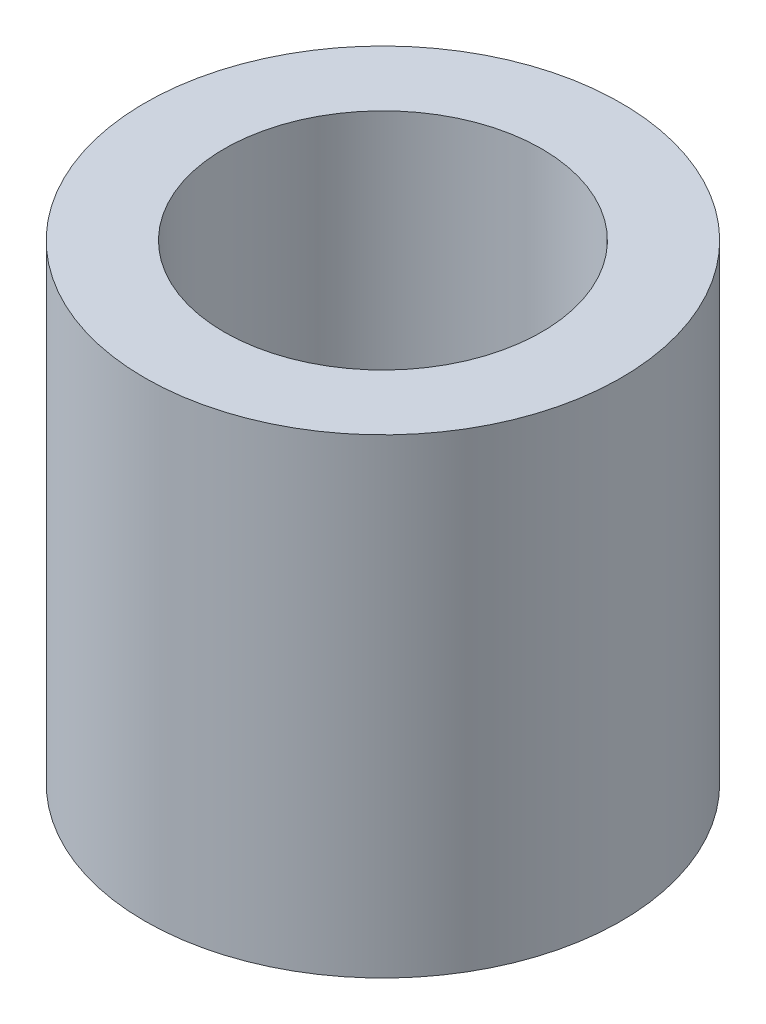
ISO-10303-21;
HEADER;
FILE_DESCRIPTION(('STEP AP214'),'2;1');
FILE_NAME('part.step','',(''),(''),'','','');
FILE_SCHEMA(('AUTOMOTIVE_DESIGN { 1 0 10303 214 1 1 1 1 }'));
ENDSEC;
DATA;
#1=APPLICATION_CONTEXT('core data for automotive mechanical design processes');
#2=APPLICATION_PROTOCOL_DEFINITION('international standard','automotive_design',2000,#1);
#3=PRODUCT_CONTEXT('',#1,'mechanical');
#4=PRODUCT('Part','Part','',(#3));
#5=PRODUCT_RELATED_PRODUCT_CATEGORY('part','',(#4));
#6=PRODUCT_DEFINITION_FORMATION('','',#4);
#7=PRODUCT_DEFINITION_CONTEXT('part definition',#1,'design');
#8=PRODUCT_DEFINITION('design','',#6,#7);
#9=PRODUCT_DEFINITION_SHAPE('','',#8);
#10=(LENGTH_UNIT() NAMED_UNIT(*) SI_UNIT(.MILLI.,.METRE.));
#11=(NAMED_UNIT(*) PLANE_ANGLE_UNIT() SI_UNIT($,.RADIAN.));
#12=(NAMED_UNIT(*) SI_UNIT($,.STERADIAN.) SOLID_ANGLE_UNIT());
#13=UNCERTAINTY_MEASURE_WITH_UNIT(LENGTH_MEASURE(1.E-05),#10,'distance_accuracy_value','');
#14=(GEOMETRIC_REPRESENTATION_CONTEXT(3) GLOBAL_UNCERTAINTY_ASSIGNED_CONTEXT((#13)) GLOBAL_UNIT_ASSIGNED_CONTEXT((#10,
#11,#12)) REPRESENTATION_CONTEXT('',''));
#15=CARTESIAN_POINT('',(0.,0.,0.));
#16=DIRECTION('',(0.,0.,1.));
#17=DIRECTION('',(1.,0.,0.));
#18=AXIS2_PLACEMENT_3D('',#15,#16,#17);
#19=CARTESIAN_POINT('',(0.,17.78,0.));
#20=DIRECTION('',(0.,1.,0.));
#21=DIRECTION('',(0.,0.,1.));
#22=AXIS2_PLACEMENT_3D('',#19,#20,#21);
#23=PLANE('',#22);
#24=CARTESIAN_POINT('',(0.,17.78,0.));
#25=DIRECTION('',(0.,1.,0.));
#26=DIRECTION('',(0.,0.,1.));
#27=AXIS2_PLACEMENT_3D('',#24,#25,#26);
#28=CIRCLE('',#27,9.);
#29=CARTESIAN_POINT('',(0.,17.78,9.));
#30=VERTEX_POINT('',#29);
#31=EDGE_CURVE('E10',#30,#30,#28,.T.);
#32=ORIENTED_EDGE('',*,*,#31,.T.);
#33=EDGE_LOOP('',(#32));
#34=FACE_BOUND('',#33,.T.);
#35=CARTESIAN_POINT('',(0.,17.78,0.));
#36=DIRECTION('',(0.,1.,0.));
#37=DIRECTION('',(0.,0.,1.));
#38=AXIS2_PLACEMENT_3D('',#35,#36,#37);
#39=CIRCLE('',#38,6.);
#40=CARTESIAN_POINT('',(0.,17.78,6.));
#41=VERTEX_POINT('',#40);
#42=EDGE_CURVE('E54',#41,#41,#39,.T.);
#43=ORIENTED_EDGE('',*,*,#42,.F.);
#44=EDGE_LOOP('',(#43));
#45=FACE_BOUND('',#44,.T.);
#46=ADVANCED_FACE('F41',(#34,#45),#23,.T.);
#47=CARTESIAN_POINT('',(0.,0.,0.));
#48=DIRECTION('',(0.,1.,0.));
#49=DIRECTION('',(0.,0.,1.));
#50=AXIS2_PLACEMENT_3D('',#47,#48,#49);
#51=PLANE('',#50);
#52=CARTESIAN_POINT('',(0.,0.,0.));
#53=DIRECTION('',(0.,1.,0.));
#54=DIRECTION('',(0.,0.,1.));
#55=AXIS2_PLACEMENT_3D('',#52,#53,#54);
#56=CIRCLE('',#55,9.);
#57=CARTESIAN_POINT('',(0.,0.,9.));
#58=VERTEX_POINT('',#57);
#59=EDGE_CURVE('E45',#58,#58,#56,.T.);
#60=ORIENTED_EDGE('',*,*,#59,.F.);
#61=EDGE_LOOP('',(#60));
#62=FACE_BOUND('',#61,.T.);
#63=CARTESIAN_POINT('',(0.,0.,0.));
#64=DIRECTION('',(0.,1.,0.));
#65=DIRECTION('',(0.,0.,1.));
#66=AXIS2_PLACEMENT_3D('',#63,#64,#65);
#67=CIRCLE('',#66,6.);
#68=CARTESIAN_POINT('',(0.,0.,6.));
#69=VERTEX_POINT('',#68);
#70=EDGE_CURVE('E56',#69,#69,#67,.T.);
#71=ORIENTED_EDGE('',*,*,#70,.T.);
#72=EDGE_LOOP('',(#71));
#73=FACE_BOUND('',#72,.T.);
#74=ADVANCED_FACE('F68',(#62,#73),#51,.F.);
#75=CARTESIAN_POINT('',(0.,17.78,0.));
#76=DIRECTION('',(0.,-1.,0.));
#77=DIRECTION('',(0.,0.,-1.));
#78=AXIS2_PLACEMENT_3D('',#75,#76,#77);
#79=CYLINDRICAL_SURFACE('',#78,9.);
#80=ORIENTED_EDGE('',*,*,#31,.F.);
#81=EDGE_LOOP('',(#80));
#82=FACE_BOUND('',#81,.T.);
#83=ORIENTED_EDGE('',*,*,#59,.T.);
#84=EDGE_LOOP('',(#83));
#85=FACE_BOUND('',#84,.T.);
#86=ADVANCED_FACE('F43',(#82,#85),#79,.T.);
#87=CARTESIAN_POINT('',(0.,17.78,0.));
#88=DIRECTION('',(0.,-1.,0.));
#89=DIRECTION('',(0.,0.,-1.));
#90=AXIS2_PLACEMENT_3D('',#87,#88,#89);
#91=CYLINDRICAL_SURFACE('',#90,6.);
#92=ORIENTED_EDGE('',*,*,#42,.T.);
#93=EDGE_LOOP('',(#92));
#94=FACE_BOUND('',#93,.T.);
#95=ORIENTED_EDGE('',*,*,#70,.F.);
#96=EDGE_LOOP('',(#95));
#97=FACE_BOUND('',#96,.T.);
#98=ADVANCED_FACE('F64',(#94,#97),#91,.F.);
#99=CLOSED_SHELL('',(#46,#74,#86,#98));
#100=MANIFOLD_SOLID_BREP('B2',#99);
#101=ADVANCED_BREP_SHAPE_REPRESENTATION('',(#18,#100),#14);
#102=SHAPE_DEFINITION_REPRESENTATION(#9,#101);
ENDSEC;
END-ISO-10303-21;
